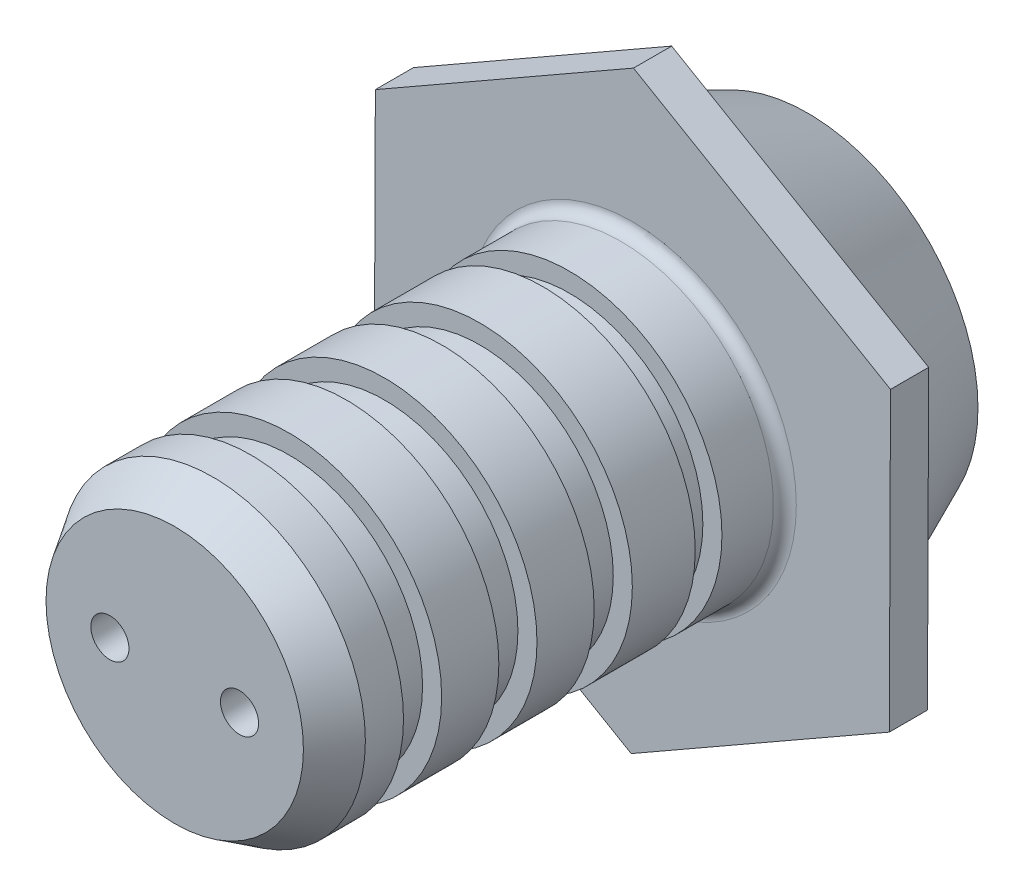
ISO-10303-21;
HEADER;
FILE_DESCRIPTION(('STEP AP214'),'2;1');
FILE_NAME('part.step','',(''),(''),'','','');
FILE_SCHEMA(('AUTOMOTIVE_DESIGN { 1 0 10303 214 1 1 1 1 }'));
ENDSEC;
DATA;
#1=APPLICATION_CONTEXT('core data for automotive mechanical design processes');
#2=APPLICATION_PROTOCOL_DEFINITION('international standard','automotive_design',2000,#1);
#3=PRODUCT_CONTEXT('',#1,'mechanical');
#4=PRODUCT('Part','Part','',(#3));
#5=PRODUCT_RELATED_PRODUCT_CATEGORY('part','',(#4));
#6=PRODUCT_DEFINITION_FORMATION('','',#4);
#7=PRODUCT_DEFINITION_CONTEXT('part definition',#1,'design');
#8=PRODUCT_DEFINITION('design','',#6,#7);
#9=PRODUCT_DEFINITION_SHAPE('','',#8);
#10=(LENGTH_UNIT() NAMED_UNIT(*) SI_UNIT(.MILLI.,.METRE.));
#11=(NAMED_UNIT(*) PLANE_ANGLE_UNIT() SI_UNIT($,.RADIAN.));
#12=(NAMED_UNIT(*) SI_UNIT($,.STERADIAN.) SOLID_ANGLE_UNIT());
#13=UNCERTAINTY_MEASURE_WITH_UNIT(LENGTH_MEASURE(1.E-05),#10,'distance_accuracy_value','');
#14=(GEOMETRIC_REPRESENTATION_CONTEXT(3) GLOBAL_UNCERTAINTY_ASSIGNED_CONTEXT((#13)) GLOBAL_UNIT_ASSIGNED_CONTEXT((#10,
#11,#12)) REPRESENTATION_CONTEXT('',''));
#15=CARTESIAN_POINT('',(0.,0.,0.));
#16=DIRECTION('',(0.,0.,1.));
#17=DIRECTION('',(1.,0.,0.));
#18=AXIS2_PLACEMENT_3D('',#15,#16,#17);
#19=CARTESIAN_POINT('',(0.,0.,-1.6));
#20=DIRECTION('',(0.,0.,1.));
#21=DIRECTION('',(1.,0.,0.));
#22=AXIS2_PLACEMENT_3D('',#19,#20,#21);
#23=CONICAL_SURFACE('',#22,5.8,0.41887902047864);
#24=CARTESIAN_POINT('',(0.,0.,-4.6));
#25=DIRECTION('',(0.,0.,1.));
#26=DIRECTION('',(1.,0.,0.));
#27=AXIS2_PLACEMENT_3D('',#24,#25,#26);
#28=CIRCLE('',#27,4.46431394407439);
#29=CARTESIAN_POINT('',(4.46431394407439,0.,-4.6));
#30=VERTEX_POINT('',#29);
#31=EDGE_CURVE('E97',#30,#30,#28,.T.);
#32=ORIENTED_EDGE('',*,*,#31,.T.);
#33=EDGE_LOOP('',(#32));
#34=FACE_BOUND('',#33,.T.);
#35=CARTESIAN_POINT('',(0.,0.,-1.60105102676295));
#36=DIRECTION('',(0.,0.,1.));
#37=DIRECTION('',(1.,0.,0.));
#38=AXIS2_PLACEMENT_3D('',#35,#36,#37);
#39=CIRCLE('',#38,5.79953205273611);
#40=CARTESIAN_POINT('',(-5.7995320528136,0.,-1.60105102676295));
#41=VERTEX_POINT('',#40);
#42=EDGE_CURVE('E63',#41,#41,#39,.T.);
#43=ORIENTED_EDGE('',*,*,#42,.F.);
#44=EDGE_LOOP('',(#43));
#45=FACE_BOUND('',#44,.T.);
#46=ADVANCED_FACE('F48',(#34,#45),#23,.T.);
#47=CARTESIAN_POINT('',(0.,0.,-4.6));
#48=DIRECTION('',(0.,0.,1.));
#49=DIRECTION('',(1.,0.,0.));
#50=AXIS2_PLACEMENT_3D('',#47,#48,#49);
#51=PLANE('',#50);
#52=CARTESIAN_POINT('',(0.,0.,-4.6));
#53=DIRECTION('',(0.,0.,1.));
#54=DIRECTION('',(1.,0.,0.));
#55=AXIS2_PLACEMENT_3D('',#52,#53,#54);
#56=CIRCLE('',#55,3.91699580482136);
#57=CARTESIAN_POINT('',(3.91699580482136,0.,-4.6));
#58=VERTEX_POINT('',#57);
#59=EDGE_CURVE('E84',#58,#58,#56,.T.);
#60=ORIENTED_EDGE('',*,*,#59,.T.);
#61=EDGE_LOOP('',(#60));
#62=FACE_BOUND('',#61,.T.);
#63=ORIENTED_EDGE('',*,*,#31,.F.);
#64=EDGE_LOOP('',(#63));
#65=FACE_BOUND('',#64,.T.);
#66=ADVANCED_FACE('F107',(#62,#65),#51,.F.);
#67=CARTESIAN_POINT('',(0.,0.,-1.30105139172067));
#68=DIRECTION('',(0.,0.,1.));
#69=DIRECTION('',(1.,0.,0.));
#70=AXIS2_PLACEMENT_3D('',#67,#68,#69);
#71=TOROIDAL_SURFACE('',#70,5.8,0.3);
#72=CARTESIAN_POINT('',(-5.8,0.,-1.30105139172067));
#73=DIRECTION('',(0.,1.,0.));
#74=DIRECTION('',(0.,0.,1.));
#75=AXIS2_PLACEMENT_3D('',#72,#73,#74);
#76=CIRCLE('',#75,0.3);
#77=CARTESIAN_POINT('',(-5.77490558612255,0.,-1.6));
#78=VERTEX_POINT('',#77);
#79=EDGE_CURVE('E57',#41,#78,#76,.T.);
#80=ORIENTED_EDGE('',*,*,#79,.F.);
#81=ORIENTED_EDGE('',*,*,#42,.T.);
#82=ORIENTED_EDGE('',*,*,#79,.T.);
#83=CARTESIAN_POINT('',(0.,0.,-1.6));
#84=DIRECTION('',(0.,0.,-1.));
#85=DIRECTION('',(-1.,0.,0.));
#86=AXIS2_PLACEMENT_3D('',#83,#84,#85);
#87=CIRCLE('',#86,5.77490558612255);
#88=EDGE_CURVE('E68',#78,#78,#87,.T.);
#89=ORIENTED_EDGE('',*,*,#88,.T.);
#90=EDGE_LOOP('',(#80,#81,#82,#89));
#91=FACE_BOUND('',#90,.T.);
#92=ADVANCED_FACE('F50',(#91),#71,.T.);
#93=CARTESIAN_POINT('',(0.,0.,-1.6));
#94=DIRECTION('',(0.,0.,1.));
#95=DIRECTION('',(1.,0.,0.));
#96=AXIS2_PLACEMENT_3D('',#93,#94,#95);
#97=PLANE('',#96);
#98=CARTESIAN_POINT('',(0.,0.,-1.6));
#99=DIRECTION('',(0.,0.,-1.));
#100=DIRECTION('',(-1.,0.,0.));
#101=AXIS2_PLACEMENT_3D('',#98,#99,#100);
#102=CIRCLE('',#101,2.49901328846124);
#103=CARTESIAN_POINT('',(-2.49901328846124,0.,-1.6));
#104=VERTEX_POINT('',#103);
#105=EDGE_CURVE('E12',#104,#104,#102,.F.);
#106=ORIENTED_EDGE('',*,*,#105,.F.);
#107=EDGE_LOOP('',(#106));
#108=FACE_BOUND('',#107,.T.);
#109=ORIENTED_EDGE('',*,*,#88,.F.);
#110=EDGE_LOOP('',(#109));
#111=FACE_BOUND('',#110,.T.);
#112=ADVANCED_FACE('F106',(#108,#111),#97,.T.);
#113=CARTESIAN_POINT('',(0.,0.,-1.3966316784621));
#114=DIRECTION('',(0.,0.,1.));
#115=DIRECTION('',(1.,0.,0.));
#116=AXIS2_PLACEMENT_3D('',#113,#114,#115);
#117=CONICAL_SURFACE('',#116,5.3432272711787,0.41887902047864);
#118=ORIENTED_EDGE('',*,*,#59,.F.);
#119=EDGE_LOOP('',(#118));
#120=FACE_BOUND('',#119,.T.);
#121=CARTESIAN_POINT('',(0.,0.,-2.1));
#122=DIRECTION('',(0.,0.,1.));
#123=DIRECTION('',(1.,0.,0.));
#124=AXIS2_PLACEMENT_3D('',#121,#122,#123);
#125=CIRCLE('',#124,5.03006751809271);
#126=CARTESIAN_POINT('',(-5.03006751809271,0.,-2.1));
#127=VERTEX_POINT('',#126);
#128=EDGE_CURVE('E87',#127,#127,#125,.F.);
#129=ORIENTED_EDGE('',*,*,#128,.F.);
#130=EDGE_LOOP('',(#129));
#131=FACE_BOUND('',#130,.T.);
#132=ADVANCED_FACE('F112',(#120,#131),#117,.F.);
#133=CARTESIAN_POINT('',(0.,0.,-2.1));
#134=DIRECTION('',(0.,0.,1.));
#135=DIRECTION('',(1.,0.,0.));
#136=AXIS2_PLACEMENT_3D('',#133,#134,#135);
#137=PLANE('',#136);
#138=CARTESIAN_POINT('',(0.,0.,-2.1));
#139=DIRECTION('',(0.,0.,-1.));
#140=DIRECTION('',(-1.,0.,0.));
#141=AXIS2_PLACEMENT_3D('',#138,#139,#140);
#142=CIRCLE('',#141,2.45813481092452);
#143=CARTESIAN_POINT('',(-2.45813481092452,0.,-2.1));
#144=VERTEX_POINT('',#143);
#145=EDGE_CURVE('E52',#144,#144,#142,.F.);
#146=ORIENTED_EDGE('',*,*,#145,.T.);
#147=EDGE_LOOP('',(#146));
#148=FACE_BOUND('',#147,.T.);
#149=ORIENTED_EDGE('',*,*,#128,.T.);
#150=EDGE_LOOP('',(#149));
#151=FACE_BOUND('',#150,.T.);
#152=ADVANCED_FACE('F79',(#148,#151),#137,.F.);
#153=CARTESIAN_POINT('',(0.,0.,-1.51907370863569));
#154=DIRECTION('',(0.,1.,0.));
#155=DIRECTION('',(0.,0.,-1.));
#156=AXIS2_PLACEMENT_3D('',#153,#154,#155);
#157=ELLIPSE('',#156,3.19455444988126,2.49981553221801);
#158=TRIMMED_CURVE('',#157,(PARAMETER_VALUE(0.)),(PARAMETER_VALUE(3.14159265358979)),.T.,.PARAMETER.);
#159=CARTESIAN_POINT('',(0.,0.,-6.96646836412995));
#160=DIRECTION('',(0.,0.,-1.));
#161=AXIS1_PLACEMENT('',#159,#160);
#162=SURFACE_OF_REVOLUTION('',#158,#161);
#163=CARTESIAN_POINT('',(0.,0.,-4.71362815851695));
#164=VERTEX_POINT('',#163);
#165=VERTEX_LOOP('',#164);
#166=FACE_BOUND('',#165,.T.);
#167=ORIENTED_EDGE('',*,*,#145,.F.);
#168=EDGE_LOOP('',(#167));
#169=FACE_BOUND('',#168,.T.);
#170=ADVANCED_FACE('F75',(#166,#169),#162,.F.);
#171=ORIENTED_EDGE('',*,*,#105,.T.);
#172=EDGE_LOOP('',(#171));
#173=FACE_BOUND('',#172,.T.);
#174=CARTESIAN_POINT('',(0.,0.,-1.51907370863569));
#175=DIRECTION('',(0.,0.,-1.));
#176=DIRECTION('',(-1.,0.,0.));
#177=AXIS2_PLACEMENT_3D('',#174,#175,#176);
#178=CIRCLE('',#177,2.49981553221801);
#179=CARTESIAN_POINT('',(-2.49981553221801,0.,-1.51907370863569));
#180=VERTEX_POINT('',#179);
#181=EDGE_CURVE('E85',#180,#180,#178,.T.);
#182=ORIENTED_EDGE('',*,*,#181,.T.);
#183=EDGE_LOOP('',(#182));
#184=FACE_BOUND('',#183,.T.);
#185=ADVANCED_FACE('F78',(#173,#184),#162,.F.);
#186=CARTESIAN_POINT('',(0.,0.,-1.51907370863569));
#187=DIRECTION('',(0.,0.,-1.));
#188=DIRECTION('',(-1.,0.,0.));
#189=AXIS2_PLACEMENT_3D('',#186,#187,#188);
#190=PLANE('',#189);
#191=ORIENTED_EDGE('',*,*,#181,.F.);
#192=EDGE_LOOP('',(#191));
#193=FACE_BOUND('',#192,.T.);
#194=ADVANCED_FACE('F128',(#193),#190,.F.);
#195=CLOSED_SHELL('',(#46,#66,#92,#112,#132,#152,#170,#185,#194));
#196=MANIFOLD_SOLID_BREP('B2',#195);
#197=CARTESIAN_POINT('',(0.,0.,11.));
#198=DIRECTION('',(0.,0.,-1.));
#199=DIRECTION('',(-1.,0.,0.));
#200=AXIS2_PLACEMENT_3D('',#197,#198,#199);
#201=CYLINDRICAL_SURFACE('',#200,4.);
#202=CARTESIAN_POINT('',(0.,0.,7.5));
#203=DIRECTION('',(0.,0.,1.));
#204=DIRECTION('',(1.,0.,0.));
#205=AXIS2_PLACEMENT_3D('',#202,#203,#204);
#206=CIRCLE('',#205,4.);
#207=CARTESIAN_POINT('',(4.,0.,7.5));
#208=VERTEX_POINT('',#207);
#209=EDGE_CURVE('E335',#208,#208,#206,.T.);
#210=ORIENTED_EDGE('',*,*,#209,.T.);
#211=EDGE_LOOP('',(#210));
#212=FACE_BOUND('',#211,.T.);
#213=CARTESIAN_POINT('',(0.,0.,9.));
#214=DIRECTION('',(0.,0.,1.));
#215=DIRECTION('',(1.,0.,0.));
#216=AXIS2_PLACEMENT_3D('',#213,#214,#215);
#217=CIRCLE('',#216,4.);
#218=CARTESIAN_POINT('',(4.,0.,9.));
#219=VERTEX_POINT('',#218);
#220=EDGE_CURVE('E326',#219,#219,#217,.T.);
#221=ORIENTED_EDGE('',*,*,#220,.F.);
#222=EDGE_LOOP('',(#221));
#223=FACE_BOUND('',#222,.T.);
#224=ADVANCED_FACE('F213',(#212,#223),#201,.T.);
#225=CARTESIAN_POINT('',(0.,0.,5.));
#226=DIRECTION('',(0.,0.,1.));
#227=DIRECTION('',(1.,0.,0.));
#228=AXIS2_PLACEMENT_3D('',#225,#226,#227);
#229=CIRCLE('',#228,4.);
#230=CARTESIAN_POINT('',(4.,0.,5.));
#231=VERTEX_POINT('',#230);
#232=EDGE_CURVE('E347',#231,#231,#229,.T.);
#233=ORIENTED_EDGE('',*,*,#232,.T.);
#234=EDGE_LOOP('',(#233));
#235=FACE_BOUND('',#234,.T.);
#236=CARTESIAN_POINT('',(0.,0.,6.5));
#237=DIRECTION('',(0.,0.,1.));
#238=DIRECTION('',(1.,0.,0.));
#239=AXIS2_PLACEMENT_3D('',#236,#237,#238);
#240=CIRCLE('',#239,4.);
#241=CARTESIAN_POINT('',(4.,0.,6.5));
#242=VERTEX_POINT('',#241);
#243=EDGE_CURVE('E338',#242,#242,#240,.T.);
#244=ORIENTED_EDGE('',*,*,#243,.F.);
#245=EDGE_LOOP('',(#244));
#246=FACE_BOUND('',#245,.T.);
#247=ADVANCED_FACE('F390',(#235,#246),#201,.T.);
#248=CARTESIAN_POINT('',(0.,0.,2.35));
#249=DIRECTION('',(0.,0.,1.));
#250=DIRECTION('',(1.,0.,0.));
#251=AXIS2_PLACEMENT_3D('',#248,#249,#250);
#252=CIRCLE('',#251,4.);
#253=CARTESIAN_POINT('',(4.,0.,2.35));
#254=VERTEX_POINT('',#253);
#255=EDGE_CURVE('E359',#254,#254,#252,.T.);
#256=ORIENTED_EDGE('',*,*,#255,.T.);
#257=EDGE_LOOP('',(#256));
#258=FACE_BOUND('',#257,.T.);
#259=CARTESIAN_POINT('',(0.,0.,4.));
#260=DIRECTION('',(0.,0.,1.));
#261=DIRECTION('',(1.,0.,0.));
#262=AXIS2_PLACEMENT_3D('',#259,#260,#261);
#263=CIRCLE('',#262,4.);
#264=CARTESIAN_POINT('',(4.,0.,4.));
#265=VERTEX_POINT('',#264);
#266=EDGE_CURVE('E350',#265,#265,#263,.T.);
#267=ORIENTED_EDGE('',*,*,#266,.F.);
#268=EDGE_LOOP('',(#267));
#269=FACE_BOUND('',#268,.T.);
#270=ADVANCED_FACE('F396',(#258,#269),#201,.T.);
#271=CARTESIAN_POINT('',(0.,0.,0.3));
#272=DIRECTION('',(0.,0.,-1.));
#273=DIRECTION('',(-1.,0.,0.));
#274=AXIS2_PLACEMENT_3D('',#271,#272,#273);
#275=CIRCLE('',#274,4.);
#276=CARTESIAN_POINT('',(-4.,0.,0.3));
#277=VERTEX_POINT('',#276);
#278=EDGE_CURVE('E222',#277,#277,#275,.F.);
#279=ORIENTED_EDGE('',*,*,#278,.T.);
#280=EDGE_LOOP('',(#279));
#281=FACE_BOUND('',#280,.T.);
#282=CARTESIAN_POINT('',(0.,0.,1.65));
#283=DIRECTION('',(0.,0.,1.));
#284=DIRECTION('',(1.,0.,0.));
#285=AXIS2_PLACEMENT_3D('',#282,#283,#284);
#286=CIRCLE('',#285,4.);
#287=CARTESIAN_POINT('',(4.,0.,1.65));
#288=VERTEX_POINT('',#287);
#289=EDGE_CURVE('E362',#288,#288,#286,.T.);
#290=ORIENTED_EDGE('',*,*,#289,.F.);
#291=EDGE_LOOP('',(#290));
#292=FACE_BOUND('',#291,.T.);
#293=ADVANCED_FACE('F372',(#281,#292),#201,.T.);
#294=CARTESIAN_POINT('',(0.,0.,1.65));
#295=DIRECTION('',(0.,0.,1.));
#296=DIRECTION('',(1.,0.,0.));
#297=AXIS2_PLACEMENT_3D('',#294,#295,#296);
#298=PLANE('',#297);
#299=CARTESIAN_POINT('',(0.,0.,1.65));
#300=DIRECTION('',(0.,0.,1.));
#301=DIRECTION('',(1.,0.,0.));
#302=AXIS2_PLACEMENT_3D('',#299,#300,#301);
#303=CIRCLE('',#302,3.5);
#304=CARTESIAN_POINT('',(3.5,0.,1.65));
#305=VERTEX_POINT('',#304);
#306=EDGE_CURVE('E356',#305,#305,#303,.T.);
#307=ORIENTED_EDGE('',*,*,#306,.F.);
#308=EDGE_LOOP('',(#307));
#309=FACE_BOUND('',#308,.T.);
#310=ORIENTED_EDGE('',*,*,#289,.T.);
#311=EDGE_LOOP('',(#310));
#312=FACE_BOUND('',#311,.T.);
#313=ADVANCED_FACE('F416',(#309,#312),#298,.T.);
#314=CARTESIAN_POINT('',(0.,0.,2.35));
#315=DIRECTION('',(0.,0.,1.));
#316=DIRECTION('',(1.,0.,0.));
#317=AXIS2_PLACEMENT_3D('',#314,#315,#316);
#318=PLANE('',#317);
#319=CARTESIAN_POINT('',(0.,0.,2.35));
#320=DIRECTION('',(0.,0.,1.));
#321=DIRECTION('',(1.,0.,0.));
#322=AXIS2_PLACEMENT_3D('',#319,#320,#321);
#323=CIRCLE('',#322,3.5);
#324=CARTESIAN_POINT('',(3.5,0.,2.35));
#325=VERTEX_POINT('',#324);
#326=EDGE_CURVE('E353',#325,#325,#323,.T.);
#327=ORIENTED_EDGE('',*,*,#326,.T.);
#328=EDGE_LOOP('',(#327));
#329=FACE_BOUND('',#328,.T.);
#330=ORIENTED_EDGE('',*,*,#255,.F.);
#331=EDGE_LOOP('',(#330));
#332=FACE_BOUND('',#331,.T.);
#333=ADVANCED_FACE('F421',(#329,#332),#318,.F.);
#334=CARTESIAN_POINT('',(0.,0.,1.65));
#335=DIRECTION('',(0.,0.,1.));
#336=DIRECTION('',(1.,0.,0.));
#337=AXIS2_PLACEMENT_3D('',#334,#335,#336);
#338=CYLINDRICAL_SURFACE('',#337,3.5);
#339=ORIENTED_EDGE('',*,*,#306,.T.);
#340=EDGE_LOOP('',(#339));
#341=FACE_BOUND('',#340,.T.);
#342=ORIENTED_EDGE('',*,*,#326,.F.);
#343=EDGE_LOOP('',(#342));
#344=FACE_BOUND('',#343,.T.);
#345=ADVANCED_FACE('F434',(#341,#344),#338,.T.);
#346=CARTESIAN_POINT('',(0.,0.,4.));
#347=DIRECTION('',(0.,0.,1.));
#348=DIRECTION('',(1.,0.,0.));
#349=AXIS2_PLACEMENT_3D('',#346,#347,#348);
#350=PLANE('',#349);
#351=CARTESIAN_POINT('',(0.,0.,4.));
#352=DIRECTION('',(0.,0.,1.));
#353=DIRECTION('',(1.,0.,0.));
#354=AXIS2_PLACEMENT_3D('',#351,#352,#353);
#355=CIRCLE('',#354,3.5);
#356=CARTESIAN_POINT('',(3.5,0.,4.));
#357=VERTEX_POINT('',#356);
#358=EDGE_CURVE('E344',#357,#357,#355,.T.);
#359=ORIENTED_EDGE('',*,*,#358,.F.);
#360=EDGE_LOOP('',(#359));
#361=FACE_BOUND('',#360,.T.);
#362=ORIENTED_EDGE('',*,*,#266,.T.);
#363=EDGE_LOOP('',(#362));
#364=FACE_BOUND('',#363,.T.);
#365=ADVANCED_FACE('F431',(#361,#364),#350,.T.);
#366=CARTESIAN_POINT('',(0.,0.,5.));
#367=DIRECTION('',(0.,0.,1.));
#368=DIRECTION('',(1.,0.,0.));
#369=AXIS2_PLACEMENT_3D('',#366,#367,#368);
#370=PLANE('',#369);
#371=CARTESIAN_POINT('',(0.,0.,5.));
#372=DIRECTION('',(0.,0.,1.));
#373=DIRECTION('',(1.,0.,0.));
#374=AXIS2_PLACEMENT_3D('',#371,#372,#373);
#375=CIRCLE('',#374,3.5);
#376=CARTESIAN_POINT('',(3.5,0.,5.));
#377=VERTEX_POINT('',#376);
#378=EDGE_CURVE('E341',#377,#377,#375,.T.);
#379=ORIENTED_EDGE('',*,*,#378,.T.);
#380=EDGE_LOOP('',(#379));
#381=FACE_BOUND('',#380,.T.);
#382=ORIENTED_EDGE('',*,*,#232,.F.);
#383=EDGE_LOOP('',(#382));
#384=FACE_BOUND('',#383,.T.);
#385=ADVANCED_FACE('F433',(#381,#384),#370,.F.);
#386=CARTESIAN_POINT('',(0.,0.,4.));
#387=DIRECTION('',(0.,0.,1.));
#388=DIRECTION('',(1.,0.,0.));
#389=AXIS2_PLACEMENT_3D('',#386,#387,#388);
#390=CYLINDRICAL_SURFACE('',#389,3.5);
#391=ORIENTED_EDGE('',*,*,#358,.T.);
#392=EDGE_LOOP('',(#391));
#393=FACE_BOUND('',#392,.T.);
#394=ORIENTED_EDGE('',*,*,#378,.F.);
#395=EDGE_LOOP('',(#394));
#396=FACE_BOUND('',#395,.T.);
#397=ADVANCED_FACE('F441',(#393,#396),#390,.T.);
#398=CARTESIAN_POINT('',(0.,0.,6.5));
#399=DIRECTION('',(0.,0.,1.));
#400=DIRECTION('',(1.,0.,0.));
#401=AXIS2_PLACEMENT_3D('',#398,#399,#400);
#402=PLANE('',#401);
#403=CARTESIAN_POINT('',(0.,0.,6.5));
#404=DIRECTION('',(0.,0.,1.));
#405=DIRECTION('',(1.,0.,0.));
#406=AXIS2_PLACEMENT_3D('',#403,#404,#405);
#407=CIRCLE('',#406,3.5);
#408=CARTESIAN_POINT('',(3.5,0.,6.5));
#409=VERTEX_POINT('',#408);
#410=EDGE_CURVE('E332',#409,#409,#407,.T.);
#411=ORIENTED_EDGE('',*,*,#410,.F.);
#412=EDGE_LOOP('',(#411));
#413=FACE_BOUND('',#412,.T.);
#414=ORIENTED_EDGE('',*,*,#243,.T.);
#415=EDGE_LOOP('',(#414));
#416=FACE_BOUND('',#415,.T.);
#417=ADVANCED_FACE('F485',(#413,#416),#402,.T.);
#418=CARTESIAN_POINT('',(0.,0.,7.5));
#419=DIRECTION('',(0.,0.,1.));
#420=DIRECTION('',(1.,0.,0.));
#421=AXIS2_PLACEMENT_3D('',#418,#419,#420);
#422=PLANE('',#421);
#423=CARTESIAN_POINT('',(0.,0.,7.5));
#424=DIRECTION('',(0.,0.,1.));
#425=DIRECTION('',(1.,0.,0.));
#426=AXIS2_PLACEMENT_3D('',#423,#424,#425);
#427=CIRCLE('',#426,3.5);
#428=CARTESIAN_POINT('',(3.5,0.,7.5));
#429=VERTEX_POINT('',#428);
#430=EDGE_CURVE('E329',#429,#429,#427,.T.);
#431=ORIENTED_EDGE('',*,*,#430,.T.);
#432=EDGE_LOOP('',(#431));
#433=FACE_BOUND('',#432,.T.);
#434=ORIENTED_EDGE('',*,*,#209,.F.);
#435=EDGE_LOOP('',(#434));
#436=FACE_BOUND('',#435,.T.);
#437=ADVANCED_FACE('F500',(#433,#436),#422,.F.);
#438=CARTESIAN_POINT('',(0.,0.,6.5));
#439=DIRECTION('',(0.,0.,1.));
#440=DIRECTION('',(1.,0.,0.));
#441=AXIS2_PLACEMENT_3D('',#438,#439,#440);
#442=CYLINDRICAL_SURFACE('',#441,3.5);
#443=ORIENTED_EDGE('',*,*,#410,.T.);
#444=EDGE_LOOP('',(#443));
#445=FACE_BOUND('',#444,.T.);
#446=ORIENTED_EDGE('',*,*,#430,.F.);
#447=EDGE_LOOP('',(#446));
#448=FACE_BOUND('',#447,.T.);
#449=ADVANCED_FACE('F510',(#445,#448),#442,.T.);
#450=CARTESIAN_POINT('',(0.,0.,9.));
#451=DIRECTION('',(0.,0.,1.));
#452=DIRECTION('',(1.,0.,0.));
#453=AXIS2_PLACEMENT_3D('',#450,#451,#452);
#454=PLANE('',#453);
#455=CARTESIAN_POINT('',(0.,0.,9.));
#456=DIRECTION('',(0.,0.,1.));
#457=DIRECTION('',(1.,0.,0.));
#458=AXIS2_PLACEMENT_3D('',#455,#456,#457);
#459=CIRCLE('',#458,3.5);
#460=CARTESIAN_POINT('',(3.5,0.,9.));
#461=VERTEX_POINT('',#460);
#462=EDGE_CURVE('E320',#461,#461,#459,.T.);
#463=ORIENTED_EDGE('',*,*,#462,.F.);
#464=EDGE_LOOP('',(#463));
#465=FACE_BOUND('',#464,.T.);
#466=ORIENTED_EDGE('',*,*,#220,.T.);
#467=EDGE_LOOP('',(#466));
#468=FACE_BOUND('',#467,.T.);
#469=ADVANCED_FACE('F518',(#465,#468),#454,.T.);
#470=CARTESIAN_POINT('',(0.,0.,10.));
#471=DIRECTION('',(0.,0.,1.));
#472=DIRECTION('',(1.,0.,0.));
#473=AXIS2_PLACEMENT_3D('',#470,#471,#472);
#474=PLANE('',#473);
#475=CARTESIAN_POINT('',(0.,0.,10.));
#476=DIRECTION('',(0.,0.,1.));
#477=DIRECTION('',(1.,0.,0.));
#478=AXIS2_PLACEMENT_3D('',#475,#476,#477);
#479=CIRCLE('',#478,3.5);
#480=CARTESIAN_POINT('',(3.5,0.,10.));
#481=VERTEX_POINT('',#480);
#482=EDGE_CURVE('E319',#481,#481,#479,.T.);
#483=ORIENTED_EDGE('',*,*,#482,.T.);
#484=EDGE_LOOP('',(#483));
#485=FACE_BOUND('',#484,.T.);
#486=CARTESIAN_POINT('',(0.,0.,10.));
#487=DIRECTION('',(0.,0.,1.));
#488=DIRECTION('',(1.,0.,0.));
#489=AXIS2_PLACEMENT_3D('',#486,#487,#488);
#490=CIRCLE('',#489,4.);
#491=CARTESIAN_POINT('',(4.,0.,10.));
#492=VERTEX_POINT('',#491);
#493=EDGE_CURVE('E323',#492,#492,#490,.T.);
#494=ORIENTED_EDGE('',*,*,#493,.F.);
#495=EDGE_LOOP('',(#494));
#496=FACE_BOUND('',#495,.T.);
#497=ADVANCED_FACE('F411',(#485,#496),#474,.F.);
#498=CARTESIAN_POINT('',(0.,0.,9.));
#499=DIRECTION('',(0.,0.,1.));
#500=DIRECTION('',(1.,0.,0.));
#501=AXIS2_PLACEMENT_3D('',#498,#499,#500);
#502=CYLINDRICAL_SURFACE('',#501,3.5);
#503=ORIENTED_EDGE('',*,*,#462,.T.);
#504=EDGE_LOOP('',(#503));
#505=FACE_BOUND('',#504,.T.);
#506=ORIENTED_EDGE('',*,*,#482,.F.);
#507=EDGE_LOOP('',(#506));
#508=FACE_BOUND('',#507,.T.);
#509=ADVANCED_FACE('F402',(#505,#508),#502,.T.);
#510=ORIENTED_EDGE('',*,*,#493,.T.);
#511=EDGE_LOOP('',(#510));
#512=FACE_BOUND('',#511,.T.);
#513=CARTESIAN_POINT('',(0.,0.,11.));
#514=DIRECTION('',(0.,0.,1.));
#515=DIRECTION('',(1.,0.,0.));
#516=AXIS2_PLACEMENT_3D('',#513,#514,#515);
#517=CIRCLE('',#516,4.);
#518=CARTESIAN_POINT('',(4.,0.,11.));
#519=VERTEX_POINT('',#518);
#520=EDGE_CURVE('E365',#519,#519,#517,.T.);
#521=ORIENTED_EDGE('',*,*,#520,.F.);
#522=EDGE_LOOP('',(#521));
#523=FACE_BOUND('',#522,.T.);
#524=ADVANCED_FACE('F392',(#512,#523),#201,.T.);
#525=CARTESIAN_POINT('',(-6.76967690400651,-3.87300304463825,-1.));
#526=DIRECTION('',(0.999992243076369,-0.00393875451023932,0.));
#527=DIRECTION('',(0.00393875451023932,0.999992243076369,0.));
#528=AXIS2_PLACEMENT_3D('',#525,#526,#527);
#529=PLANE('',#528);
#530=DIRECTION('',(0.00393875451023932,0.999992243076369,0.));
#531=VECTOR('',#530,1.);
#532=CARTESIAN_POINT('',(-6.76967690400651,-3.87300304463825,0.));
#533=LINE('',#532,#531);
#534=CARTESIAN_POINT('',(-6.76967690400651,-3.87300304463825,0.));
#535=VERTEX_POINT('',#534);
#536=CARTESIAN_POINT('',(-6.73895747759446,3.9262106519633,0.));
#537=VERTEX_POINT('',#536);
#538=EDGE_CURVE('E299',#535,#537,#533,.T.);
#539=ORIENTED_EDGE('',*,*,#538,.T.);
#540=DIRECTION('',(0.,0.,1.));
#541=VECTOR('',#540,1.);
#542=CARTESIAN_POINT('',(-6.73895747759446,3.9262106519633,-1.));
#543=LINE('',#542,#541);
#544=CARTESIAN_POINT('',(-6.73895747759446,3.9262106519633,-1.));
#545=VERTEX_POINT('',#544);
#546=EDGE_CURVE('E317',#545,#537,#543,.T.);
#547=ORIENTED_EDGE('',*,*,#546,.F.);
#548=DIRECTION('',(0.00393875451023932,0.999992243076369,0.));
#549=VECTOR('',#548,1.);
#550=CARTESIAN_POINT('',(-6.76967690400651,-3.87300304463825,-1.));
#551=LINE('',#550,#549);
#552=CARTESIAN_POINT('',(-6.76967690400651,-3.87300304463825,-1.));
#553=VERTEX_POINT('',#552);
#554=EDGE_CURVE('E310',#553,#545,#551,.T.);
#555=ORIENTED_EDGE('',*,*,#554,.F.);
#556=DIRECTION('',(0.,0.,1.));
#557=VECTOR('',#556,1.);
#558=CARTESIAN_POINT('',(-6.76967690400651,-3.87300304463825,-1.));
#559=LINE('',#558,#557);
#560=EDGE_CURVE('E295',#553,#535,#559,.T.);
#561=ORIENTED_EDGE('',*,*,#560,.T.);
#562=EDGE_LOOP('',(#539,#547,#555,#561));
#563=FACE_BOUND('',#562,.T.);
#564=ADVANCED_FACE('F401',(#563),#529,.F.);
#565=CARTESIAN_POINT('',(-6.73895747759446,3.9262106519633,-1.));
#566=DIRECTION('',(0.496585060073047,-0.867988063346639,0.));
#567=DIRECTION('',(0.867988063346639,0.496585060073047,0.));
#568=AXIS2_PLACEMENT_3D('',#565,#566,#567);
#569=PLANE('',#568);
#570=DIRECTION('',(0.867988063346639,0.496585060073047,0.));
#571=VECTOR('',#570,1.);
#572=CARTESIAN_POINT('',(-6.73895747759446,3.9262106519633,0.));
#573=LINE('',#572,#571);
#574=CARTESIAN_POINT('',(0.0307194264120538,7.79921369660155,0.));
#575=VERTEX_POINT('',#574);
#576=EDGE_CURVE('E302',#537,#575,#573,.T.);
#577=ORIENTED_EDGE('',*,*,#576,.T.);
#578=DIRECTION('',(0.,0.,1.));
#579=VECTOR('',#578,1.);
#580=CARTESIAN_POINT('',(0.0307194264120538,7.79921369660155,-1.));
#581=LINE('',#580,#579);
#582=CARTESIAN_POINT('',(0.0307194264120538,7.79921369660155,-1.));
#583=VERTEX_POINT('',#582);
#584=EDGE_CURVE('E314',#583,#575,#581,.T.);
#585=ORIENTED_EDGE('',*,*,#584,.F.);
#586=DIRECTION('',(0.867988063346639,0.496585060073047,0.));
#587=VECTOR('',#586,1.);
#588=CARTESIAN_POINT('',(-6.73895747759446,3.9262106519633,-1.));
#589=LINE('',#588,#587);
#590=EDGE_CURVE('E268',#545,#583,#589,.T.);
#591=ORIENTED_EDGE('',*,*,#590,.F.);
#592=ORIENTED_EDGE('',*,*,#546,.T.);
#593=EDGE_LOOP('',(#577,#585,#591,#592));
#594=FACE_BOUND('',#593,.T.);
#595=ADVANCED_FACE('F408',(#594),#569,.F.);
#596=CARTESIAN_POINT('',(0.0307194264120538,7.79921369660155,-1.));
#597=DIRECTION('',(-0.503407183003323,-0.864049308836399,0.));
#598=DIRECTION('',(0.864049308836399,-0.503407183003323,0.));
#599=AXIS2_PLACEMENT_3D('',#596,#597,#598);
#600=PLANE('',#599);
#601=DIRECTION('',(0.864049308836399,-0.503407183003323,0.));
#602=VECTOR('',#601,1.);
#603=CARTESIAN_POINT('',(0.0307194264120538,7.79921369660155,0.));
#604=LINE('',#603,#602);
#605=CARTESIAN_POINT('',(6.76967690400651,3.87300304463825,0.));
#606=VERTEX_POINT('',#605);
#607=EDGE_CURVE('E305',#575,#606,#604,.T.);
#608=ORIENTED_EDGE('',*,*,#607,.T.);
#609=DIRECTION('',(0.,0.,1.));
#610=VECTOR('',#609,1.);
#611=CARTESIAN_POINT('',(6.76967690400651,3.87300304463825,-1.));
#612=LINE('',#611,#610);
#613=CARTESIAN_POINT('',(6.76967690400651,3.87300304463825,-1.));
#614=VERTEX_POINT('',#613);
#615=EDGE_CURVE('E290',#614,#606,#612,.T.);
#616=ORIENTED_EDGE('',*,*,#615,.F.);
#617=DIRECTION('',(0.864049308836399,-0.503407183003323,0.));
#618=VECTOR('',#617,1.);
#619=CARTESIAN_POINT('',(0.0307194264120538,7.79921369660155,-1.));
#620=LINE('',#619,#618);
#621=EDGE_CURVE('E281',#583,#614,#620,.T.);
#622=ORIENTED_EDGE('',*,*,#621,.F.);
#623=ORIENTED_EDGE('',*,*,#584,.T.);
#624=EDGE_LOOP('',(#608,#616,#622,#623));
#625=FACE_BOUND('',#624,.T.);
#626=ADVANCED_FACE('F568',(#625),#600,.F.);
#627=CARTESIAN_POINT('',(6.76967690400651,3.87300304463825,-1.));
#628=DIRECTION('',(-0.999992243076369,0.00393875451023921,0.));
#629=DIRECTION('',(-0.00393875451023921,-0.999992243076369,0.));
#630=AXIS2_PLACEMENT_3D('',#627,#628,#629);
#631=PLANE('',#630);
#632=DIRECTION('',(-0.00393875451023921,-0.999992243076369,0.));
#633=VECTOR('',#632,1.);
#634=CARTESIAN_POINT('',(6.76967690400651,3.87300304463825,0.));
#635=LINE('',#634,#633);
#636=CARTESIAN_POINT('',(6.73895747759446,-3.9262106519633,0.));
#637=VERTEX_POINT('',#636);
#638=EDGE_CURVE('E289',#606,#637,#635,.T.);
#639=ORIENTED_EDGE('',*,*,#638,.T.);
#640=DIRECTION('',(0.,0.,1.));
#641=VECTOR('',#640,1.);
#642=CARTESIAN_POINT('',(6.73895747759446,-3.9262106519633,-1.));
#643=LINE('',#642,#641);
#644=CARTESIAN_POINT('',(6.73895747759446,-3.9262106519633,-1.));
#645=VERTEX_POINT('',#644);
#646=EDGE_CURVE('E286',#645,#637,#643,.T.);
#647=ORIENTED_EDGE('',*,*,#646,.F.);
#648=DIRECTION('',(-0.00393875451023921,-0.999992243076369,0.));
#649=VECTOR('',#648,1.);
#650=CARTESIAN_POINT('',(6.76967690400651,3.87300304463825,-1.));
#651=LINE('',#650,#649);
#652=EDGE_CURVE('E275',#614,#645,#651,.T.);
#653=ORIENTED_EDGE('',*,*,#652,.F.);
#654=ORIENTED_EDGE('',*,*,#615,.T.);
#655=EDGE_LOOP('',(#639,#647,#653,#654));
#656=FACE_BOUND('',#655,.T.);
#657=ADVANCED_FACE('F287',(#656),#631,.F.);
#658=CARTESIAN_POINT('',(6.73895747759446,-3.9262106519633,-1.));
#659=DIRECTION('',(-0.496585060073047,0.867988063346639,0.));
#660=DIRECTION('',(-0.867988063346639,-0.496585060073047,0.));
#661=AXIS2_PLACEMENT_3D('',#658,#659,#660);
#662=PLANE('',#661);
#663=DIRECTION('',(-0.867988063346639,-0.496585060073047,0.));
#664=VECTOR('',#663,1.);
#665=CARTESIAN_POINT('',(6.73895747759446,-3.9262106519633,0.));
#666=LINE('',#665,#664);
#667=CARTESIAN_POINT('',(-0.0307194264120552,-7.79921369660156,0.));
#668=VERTEX_POINT('',#667);
#669=EDGE_CURVE('E253',#637,#668,#666,.T.);
#670=ORIENTED_EDGE('',*,*,#669,.T.);
#671=DIRECTION('',(0.,0.,1.));
#672=VECTOR('',#671,1.);
#673=CARTESIAN_POINT('',(-0.0307194264120552,-7.79921369660156,-1.));
#674=LINE('',#673,#672);
#675=CARTESIAN_POINT('',(-0.0307194264120552,-7.79921369660156,-1.));
#676=VERTEX_POINT('',#675);
#677=EDGE_CURVE('E291',#676,#668,#674,.T.);
#678=ORIENTED_EDGE('',*,*,#677,.F.);
#679=DIRECTION('',(-0.867988063346639,-0.496585060073047,0.));
#680=VECTOR('',#679,1.);
#681=CARTESIAN_POINT('',(6.73895747759446,-3.9262106519633,-1.));
#682=LINE('',#681,#680);
#683=EDGE_CURVE('E279',#645,#676,#682,.T.);
#684=ORIENTED_EDGE('',*,*,#683,.F.);
#685=ORIENTED_EDGE('',*,*,#646,.T.);
#686=EDGE_LOOP('',(#670,#678,#684,#685));
#687=FACE_BOUND('',#686,.T.);
#688=ADVANCED_FACE('F293',(#687),#662,.F.);
#689=CARTESIAN_POINT('',(-0.0307194264120552,-7.79921369660156,-1.));
#690=DIRECTION('',(0.503407183003322,0.864049308836399,0.));
#691=DIRECTION('',(-0.864049308836399,0.503407183003322,0.));
#692=AXIS2_PLACEMENT_3D('',#689,#690,#691);
#693=PLANE('',#692);
#694=DIRECTION('',(-0.864049308836399,0.503407183003322,0.));
#695=VECTOR('',#694,1.);
#696=CARTESIAN_POINT('',(-0.0307194264120552,-7.79921369660156,0.));
#697=LINE('',#696,#695);
#698=EDGE_CURVE('E259',#668,#535,#697,.T.);
#699=ORIENTED_EDGE('',*,*,#698,.T.);
#700=ORIENTED_EDGE('',*,*,#560,.F.);
#701=DIRECTION('',(-0.864049308836399,0.503407183003322,0.));
#702=VECTOR('',#701,1.);
#703=CARTESIAN_POINT('',(-0.0307194264120552,-7.79921369660156,-1.));
#704=LINE('',#703,#702);
#705=EDGE_CURVE('E230',#676,#553,#704,.T.);
#706=ORIENTED_EDGE('',*,*,#705,.F.);
#707=ORIENTED_EDGE('',*,*,#677,.T.);
#708=EDGE_LOOP('',(#699,#700,#706,#707));
#709=FACE_BOUND('',#708,.T.);
#710=ADVANCED_FACE('F594',(#709),#693,.F.);
#711=CARTESIAN_POINT('',(0.,0.,-1.));
#712=DIRECTION('',(0.,0.,-1.));
#713=DIRECTION('',(-1.,0.,0.));
#714=AXIS2_PLACEMENT_3D('',#711,#712,#713);
#715=PLANE('',#714);
#716=ORIENTED_EDGE('',*,*,#554,.T.);
#717=ORIENTED_EDGE('',*,*,#590,.T.);
#718=ORIENTED_EDGE('',*,*,#621,.T.);
#719=ORIENTED_EDGE('',*,*,#652,.T.);
#720=ORIENTED_EDGE('',*,*,#683,.T.);
#721=ORIENTED_EDGE('',*,*,#705,.T.);
#722=EDGE_LOOP('',(#716,#717,#718,#719,#720,#721));
#723=FACE_BOUND('',#722,.T.);
#724=ADVANCED_FACE('F277',(#723),#715,.T.);
#725=CARTESIAN_POINT('',(0.,0.,0.));
#726=DIRECTION('',(0.,0.,-1.));
#727=DIRECTION('',(-1.,0.,0.));
#728=AXIS2_PLACEMENT_3D('',#725,#726,#727);
#729=PLANE('',#728);
#730=CARTESIAN_POINT('',(0.,0.,0.));
#731=DIRECTION('',(0.,0.,-1.));
#732=DIRECTION('',(-1.,0.,0.));
#733=AXIS2_PLACEMENT_3D('',#730,#731,#732);
#734=CIRCLE('',#733,4.3);
#735=CARTESIAN_POINT('',(-4.3,0.,0.));
#736=VERTEX_POINT('',#735);
#737=EDGE_CURVE('E46',#736,#736,#734,.T.);
#738=ORIENTED_EDGE('',*,*,#737,.T.);
#739=EDGE_LOOP('',(#738));
#740=FACE_BOUND('',#739,.T.);
#741=ORIENTED_EDGE('',*,*,#538,.F.);
#742=ORIENTED_EDGE('',*,*,#698,.F.);
#743=ORIENTED_EDGE('',*,*,#669,.F.);
#744=ORIENTED_EDGE('',*,*,#638,.F.);
#745=ORIENTED_EDGE('',*,*,#607,.F.);
#746=ORIENTED_EDGE('',*,*,#576,.F.);
#747=EDGE_LOOP('',(#741,#742,#743,#744,#745,#746));
#748=FACE_BOUND('',#747,.T.);
#749=ADVANCED_FACE('F377',(#740,#748),#729,.F.);
#750=CARTESIAN_POINT('',(0.,0.,0.3));
#751=DIRECTION('',(0.,0.,-1.));
#752=DIRECTION('',(-1.,0.,0.));
#753=AXIS2_PLACEMENT_3D('',#750,#751,#752);
#754=TOROIDAL_SURFACE('',#753,4.3,0.3);
#755=ORIENTED_EDGE('',*,*,#737,.F.);
#756=EDGE_LOOP('',(#755));
#757=FACE_BOUND('',#756,.T.);
#758=ORIENTED_EDGE('',*,*,#278,.F.);
#759=EDGE_LOOP('',(#758));
#760=FACE_BOUND('',#759,.T.);
#761=ADVANCED_FACE('F215',(#757,#760),#754,.F.);
#762=CARTESIAN_POINT('',(0.,0.,11.));
#763=DIRECTION('',(0.,0.,-1.));
#764=DIRECTION('',(1.,0.,0.));
#765=AXIS2_PLACEMENT_3D('',#762,#763,#764);
#766=CONICAL_SURFACE('',#765,4.,0.558505360638187);
#767=CARTESIAN_POINT('',(0.,0.,12.));
#768=DIRECTION('',(0.,0.,1.));
#769=DIRECTION('',(1.,0.,0.));
#770=AXIS2_PLACEMENT_3D('',#767,#768,#769);
#771=CIRCLE('',#770,3.37513064809067);
#772=CARTESIAN_POINT('',(3.37513064809067,0.,12.));
#773=VERTEX_POINT('',#772);
#774=EDGE_CURVE('E303',#773,#773,#771,.T.);
#775=ORIENTED_EDGE('',*,*,#774,.F.);
#776=EDGE_LOOP('',(#775));
#777=FACE_BOUND('',#776,.T.);
#778=ORIENTED_EDGE('',*,*,#520,.T.);
#779=EDGE_LOOP('',(#778));
#780=FACE_BOUND('',#779,.T.);
#781=ADVANCED_FACE('F376',(#777,#780),#766,.T.);
#782=CARTESIAN_POINT('',(0.,0.,12.));
#783=DIRECTION('',(0.,0.,1.));
#784=DIRECTION('',(1.,0.,0.));
#785=AXIS2_PLACEMENT_3D('',#782,#783,#784);
#786=PLANE('',#785);
#787=CARTESIAN_POINT('',(-1.7,0.,12.));
#788=DIRECTION('',(0.,0.,1.));
#789=DIRECTION('',(1.,0.,0.));
#790=AXIS2_PLACEMENT_3D('',#787,#788,#789);
#791=CIRCLE('',#790,0.5);
#792=CARTESIAN_POINT('',(-1.2,0.,12.));
#793=VERTEX_POINT('',#792);
#794=EDGE_CURVE('E686',#793,#793,#791,.T.);
#795=ORIENTED_EDGE('',*,*,#794,.F.);
#796=EDGE_LOOP('',(#795));
#797=FACE_BOUND('',#796,.T.);
#798=CARTESIAN_POINT('',(1.7,0.,12.));
#799=DIRECTION('',(0.,0.,1.));
#800=DIRECTION('',(1.,0.,0.));
#801=AXIS2_PLACEMENT_3D('',#798,#799,#800);
#802=CIRCLE('',#801,0.5);
#803=CARTESIAN_POINT('',(2.2,0.,12.));
#804=VERTEX_POINT('',#803);
#805=EDGE_CURVE('E696',#804,#804,#802,.T.);
#806=ORIENTED_EDGE('',*,*,#805,.F.);
#807=EDGE_LOOP('',(#806));
#808=FACE_BOUND('',#807,.T.);
#809=ORIENTED_EDGE('',*,*,#774,.T.);
#810=EDGE_LOOP('',(#809));
#811=FACE_BOUND('',#810,.T.);
#812=ADVANCED_FACE('F383',(#797,#808,#811),#786,.T.);
#813=CARTESIAN_POINT('',(1.7,0.,11.));
#814=DIRECTION('',(0.,0.,1.));
#815=DIRECTION('',(1.,0.,0.));
#816=AXIS2_PLACEMENT_3D('',#813,#814,#815);
#817=CYLINDRICAL_SURFACE('',#816,0.5);
#818=CARTESIAN_POINT('',(1.7,0.,11.));
#819=DIRECTION('',(0.,0.,1.));
#820=DIRECTION('',(1.,0.,0.));
#821=AXIS2_PLACEMENT_3D('',#818,#819,#820);
#822=CIRCLE('',#821,0.5);
#823=CARTESIAN_POINT('',(2.2,0.,11.));
#824=VERTEX_POINT('',#823);
#825=EDGE_CURVE('E691',#824,#824,#822,.T.);
#826=ORIENTED_EDGE('',*,*,#825,.F.);
#827=EDGE_LOOP('',(#826));
#828=FACE_BOUND('',#827,.T.);
#829=ORIENTED_EDGE('',*,*,#805,.T.);
#830=EDGE_LOOP('',(#829));
#831=FACE_BOUND('',#830,.T.);
#832=ADVANCED_FACE('F639',(#828,#831),#817,.F.);
#833=CARTESIAN_POINT('',(1.7,0.,11.));
#834=DIRECTION('',(0.,0.,1.));
#835=DIRECTION('',(1.,0.,0.));
#836=AXIS2_PLACEMENT_3D('',#833,#834,#835);
#837=PLANE('',#836);
#838=ORIENTED_EDGE('',*,*,#825,.T.);
#839=EDGE_LOOP('',(#838));
#840=FACE_BOUND('',#839,.T.);
#841=ADVANCED_FACE('F649',(#840),#837,.T.);
#842=CARTESIAN_POINT('',(-1.7,0.,11.));
#843=DIRECTION('',(0.,0.,1.));
#844=DIRECTION('',(1.,0.,0.));
#845=AXIS2_PLACEMENT_3D('',#842,#843,#844);
#846=CYLINDRICAL_SURFACE('',#845,0.5);
#847=CARTESIAN_POINT('',(-1.7,0.,11.));
#848=DIRECTION('',(0.,0.,1.));
#849=DIRECTION('',(1.,0.,0.));
#850=AXIS2_PLACEMENT_3D('',#847,#848,#849);
#851=CIRCLE('',#850,0.5);
#852=CARTESIAN_POINT('',(-1.2,0.,11.));
#853=VERTEX_POINT('',#852);
#854=EDGE_CURVE('E685',#853,#853,#851,.T.);
#855=ORIENTED_EDGE('',*,*,#854,.F.);
#856=EDGE_LOOP('',(#855));
#857=FACE_BOUND('',#856,.T.);
#858=ORIENTED_EDGE('',*,*,#794,.T.);
#859=EDGE_LOOP('',(#858));
#860=FACE_BOUND('',#859,.T.);
#861=ADVANCED_FACE('F659',(#857,#860),#846,.F.);
#862=CARTESIAN_POINT('',(-1.7,0.,11.));
#863=DIRECTION('',(0.,0.,1.));
#864=DIRECTION('',(1.,0.,0.));
#865=AXIS2_PLACEMENT_3D('',#862,#863,#864);
#866=PLANE('',#865);
#867=ORIENTED_EDGE('',*,*,#854,.T.);
#868=EDGE_LOOP('',(#867));
#869=FACE_BOUND('',#868,.T.);
#870=ADVANCED_FACE('F669',(#869),#866,.T.);
#871=CLOSED_SHELL('',(#224,#247,#270,#293,#313,#333,#345,#365,#385,#397,#417,#437,#449,#469,
#497,#509,#524,#564,#595,#626,#657,#688,#710,#724,#749,#761,#781,#812,#832,#841,#861,#870));
#872=MANIFOLD_SOLID_BREP('B6',#871);
#873=ADVANCED_BREP_SHAPE_REPRESENTATION('',(#18,#196,#872),#14);
#874=SHAPE_DEFINITION_REPRESENTATION(#9,#873);
ENDSEC;
END-ISO-10303-21;
